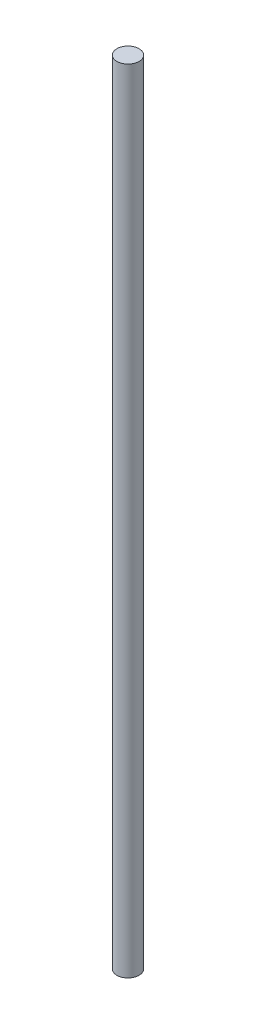
ISO-10303-21;
HEADER;
FILE_DESCRIPTION(('STEP AP214'),'2;1');
FILE_NAME('part.step','',(''),(''),'','','');
FILE_SCHEMA(('AUTOMOTIVE_DESIGN { 1 0 10303 214 1 1 1 1 }'));
ENDSEC;
DATA;
#1=APPLICATION_CONTEXT('core data for automotive mechanical design processes');
#2=APPLICATION_PROTOCOL_DEFINITION('international standard','automotive_design',2000,#1);
#3=PRODUCT_CONTEXT('',#1,'mechanical');
#4=PRODUCT('Part','Part','',(#3));
#5=PRODUCT_RELATED_PRODUCT_CATEGORY('part','',(#4));
#6=PRODUCT_DEFINITION_FORMATION('','',#4);
#7=PRODUCT_DEFINITION_CONTEXT('part definition',#1,'design');
#8=PRODUCT_DEFINITION('design','',#6,#7);
#9=PRODUCT_DEFINITION_SHAPE('','',#8);
#10=(LENGTH_UNIT() NAMED_UNIT(*) SI_UNIT(.MILLI.,.METRE.));
#11=(NAMED_UNIT(*) PLANE_ANGLE_UNIT() SI_UNIT($,.RADIAN.));
#12=(NAMED_UNIT(*) SI_UNIT($,.STERADIAN.) SOLID_ANGLE_UNIT());
#13=UNCERTAINTY_MEASURE_WITH_UNIT(LENGTH_MEASURE(1.E-05),#10,'distance_accuracy_value','');
#14=(GEOMETRIC_REPRESENTATION_CONTEXT(3) GLOBAL_UNCERTAINTY_ASSIGNED_CONTEXT((#13)) GLOBAL_UNIT_ASSIGNED_CONTEXT((#10,
#11,#12)) REPRESENTATION_CONTEXT('',''));
#15=CARTESIAN_POINT('',(0.,0.,0.));
#16=DIRECTION('',(0.,0.,1.));
#17=DIRECTION('',(1.,0.,0.));
#18=AXIS2_PLACEMENT_3D('',#15,#16,#17);
#19=CARTESIAN_POINT('',(0.,250.,0.));
#20=DIRECTION('',(0.,-1.,0.));
#21=DIRECTION('',(0.,0.,-1.));
#22=AXIS2_PLACEMENT_3D('',#19,#20,#21);
#23=CYLINDRICAL_SURFACE('',#22,3.5);
#24=CARTESIAN_POINT('',(0.,250.,0.));
#25=DIRECTION('',(0.,1.,0.));
#26=DIRECTION('',(0.,0.,1.));
#27=AXIS2_PLACEMENT_3D('',#24,#25,#26);
#28=CIRCLE('',#27,3.5);
#29=CARTESIAN_POINT('',(0.,250.,3.5));
#30=VERTEX_POINT('',#29);
#31=EDGE_CURVE('E10',#30,#30,#28,.T.);
#32=ORIENTED_EDGE('',*,*,#31,.F.);
#33=EDGE_LOOP('',(#32));
#34=FACE_BOUND('',#33,.T.);
#35=CARTESIAN_POINT('',(0.,0.,0.));
#36=DIRECTION('',(0.,1.,0.));
#37=DIRECTION('',(0.,0.,1.));
#38=AXIS2_PLACEMENT_3D('',#35,#36,#37);
#39=CIRCLE('',#38,3.5);
#40=CARTESIAN_POINT('',(0.,0.,3.5));
#41=VERTEX_POINT('',#40);
#42=EDGE_CURVE('E40',#41,#41,#39,.T.);
#43=ORIENTED_EDGE('',*,*,#42,.T.);
#44=EDGE_LOOP('',(#43));
#45=FACE_BOUND('',#44,.T.);
#46=ADVANCED_FACE('F37',(#34,#45),#23,.T.);
#47=CARTESIAN_POINT('',(0.,250.,0.));
#48=DIRECTION('',(0.,1.,0.));
#49=DIRECTION('',(0.,0.,1.));
#50=AXIS2_PLACEMENT_3D('',#47,#48,#49);
#51=PLANE('',#50);
#52=ORIENTED_EDGE('',*,*,#31,.T.);
#53=EDGE_LOOP('',(#52));
#54=FACE_BOUND('',#53,.T.);
#55=ADVANCED_FACE('F54',(#54),#51,.T.);
#56=CARTESIAN_POINT('',(0.,0.,0.));
#57=DIRECTION('',(0.,1.,0.));
#58=DIRECTION('',(0.,0.,1.));
#59=AXIS2_PLACEMENT_3D('',#56,#57,#58);
#60=PLANE('',#59);
#61=ORIENTED_EDGE('',*,*,#42,.F.);
#62=EDGE_LOOP('',(#61));
#63=FACE_BOUND('',#62,.T.);
#64=ADVANCED_FACE('F52',(#63),#60,.F.);
#65=CLOSED_SHELL('',(#46,#55,#64));
#66=MANIFOLD_SOLID_BREP('B2',#65);
#67=ADVANCED_BREP_SHAPE_REPRESENTATION('',(#18,#66),#14);
#68=SHAPE_DEFINITION_REPRESENTATION(#9,#67);
ENDSEC;
END-ISO-10303-21;
